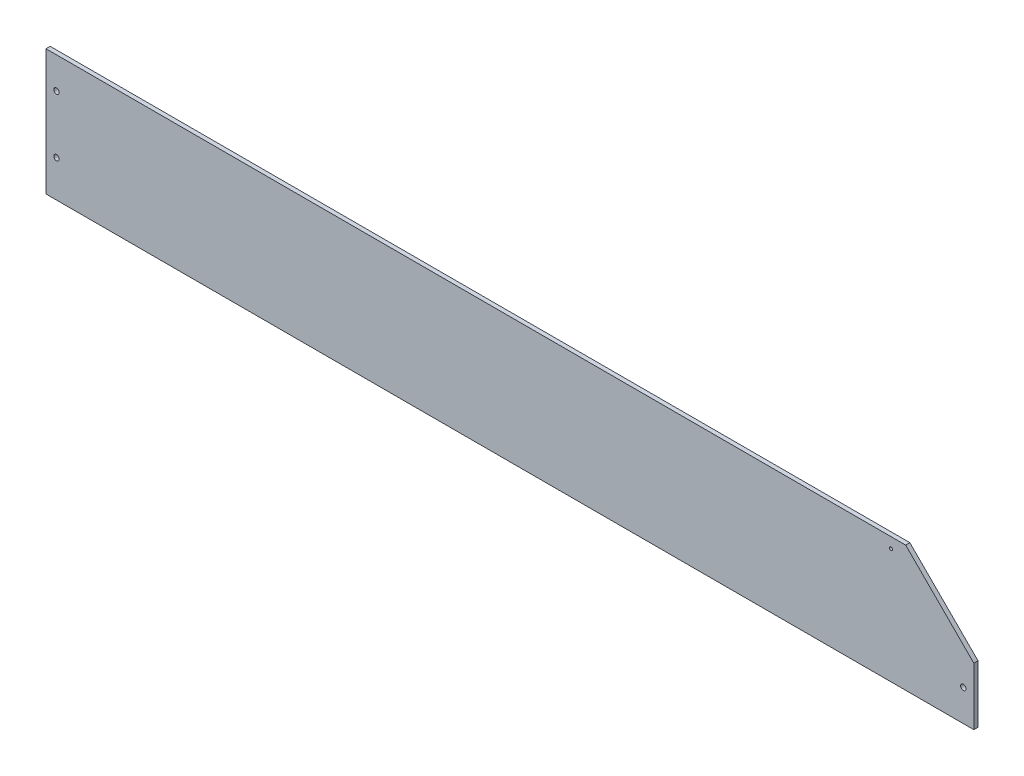
ISO-10303-21;
HEADER;
FILE_DESCRIPTION(('STEP AP214'),'2;1');
FILE_NAME('part.step','',(''),(''),'','','');
FILE_SCHEMA(('AUTOMOTIVE_DESIGN { 1 0 10303 214 1 1 1 1 }'));
ENDSEC;
DATA;
#1=APPLICATION_CONTEXT('core data for automotive mechanical design processes');
#2=APPLICATION_PROTOCOL_DEFINITION('international standard','automotive_design',2000,#1);
#3=PRODUCT_CONTEXT('',#1,'mechanical');
#4=PRODUCT('Part','Part','',(#3));
#5=PRODUCT_RELATED_PRODUCT_CATEGORY('part','',(#4));
#6=PRODUCT_DEFINITION_FORMATION('','',#4);
#7=PRODUCT_DEFINITION_CONTEXT('part definition',#1,'design');
#8=PRODUCT_DEFINITION('design','',#6,#7);
#9=PRODUCT_DEFINITION_SHAPE('','',#8);
#10=(LENGTH_UNIT() NAMED_UNIT(*) SI_UNIT(.MILLI.,.METRE.));
#11=(NAMED_UNIT(*) PLANE_ANGLE_UNIT() SI_UNIT($,.RADIAN.));
#12=(NAMED_UNIT(*) SI_UNIT($,.STERADIAN.) SOLID_ANGLE_UNIT());
#13=UNCERTAINTY_MEASURE_WITH_UNIT(LENGTH_MEASURE(1.E-05),#10,'distance_accuracy_value','');
#14=(GEOMETRIC_REPRESENTATION_CONTEXT(3) GLOBAL_UNCERTAINTY_ASSIGNED_CONTEXT((#13)) GLOBAL_UNIT_ASSIGNED_CONTEXT((#10,
#11,#12)) REPRESENTATION_CONTEXT('',''));
#15=CARTESIAN_POINT('',(0.,0.,0.));
#16=DIRECTION('',(0.,0.,1.));
#17=DIRECTION('',(1.,0.,0.));
#18=AXIS2_PLACEMENT_3D('',#15,#16,#17);
#19=CARTESIAN_POINT('',(0.,120.,-4.));
#20=DIRECTION('',(1.,0.,0.));
#21=DIRECTION('',(0.,0.,1.));
#22=AXIS2_PLACEMENT_3D('',#19,#20,#21);
#23=PLANE('',#22);
#24=DIRECTION('',(0.,-1.,0.));
#25=VECTOR('',#24,1.);
#26=CARTESIAN_POINT('',(0.,120.,0.));
#27=LINE('',#26,#25);
#28=CARTESIAN_POINT('',(0.,120.,0.));
#29=VERTEX_POINT('',#28);
#30=CARTESIAN_POINT('',(0.,0.,0.));
#31=VERTEX_POINT('',#30);
#32=EDGE_CURVE('E113',#29,#31,#27,.T.);
#33=ORIENTED_EDGE('',*,*,#32,.F.);
#34=DIRECTION('',(0.,0.,1.));
#35=VECTOR('',#34,1.);
#36=CARTESIAN_POINT('',(0.,120.,-4.));
#37=LINE('',#36,#35);
#38=CARTESIAN_POINT('',(0.,120.,-4.));
#39=VERTEX_POINT('',#38);
#40=EDGE_CURVE('E112',#39,#29,#37,.T.);
#41=ORIENTED_EDGE('',*,*,#40,.F.);
#42=DIRECTION('',(0.,-1.,0.));
#43=VECTOR('',#42,1.);
#44=CARTESIAN_POINT('',(0.,120.,-4.));
#45=LINE('',#44,#43);
#46=CARTESIAN_POINT('',(0.,0.,-4.));
#47=VERTEX_POINT('',#46);
#48=EDGE_CURVE('E107',#39,#47,#45,.T.);
#49=ORIENTED_EDGE('',*,*,#48,.T.);
#50=DIRECTION('',(0.,0.,1.));
#51=VECTOR('',#50,1.);
#52=CARTESIAN_POINT('',(0.,0.,-4.));
#53=LINE('',#52,#51);
#54=EDGE_CURVE('E11',#47,#31,#53,.T.);
#55=ORIENTED_EDGE('',*,*,#54,.T.);
#56=EDGE_LOOP('',(#33,#41,#49,#55));
#57=FACE_BOUND('',#56,.T.);
#58=ADVANCED_FACE('F38',(#57),#23,.F.);
#59=CARTESIAN_POINT('',(0.,0.,-4.));
#60=DIRECTION('',(0.,1.,0.));
#61=DIRECTION('',(0.,0.,-1.));
#62=AXIS2_PLACEMENT_3D('',#59,#60,#61);
#63=PLANE('',#62);
#64=DIRECTION('',(1.,0.,0.));
#65=VECTOR('',#64,1.);
#66=CARTESIAN_POINT('',(0.,0.,0.));
#67=LINE('',#66,#65);
#68=CARTESIAN_POINT('',(885.,0.,0.));
#69=VERTEX_POINT('',#68);
#70=EDGE_CURVE('E115',#31,#69,#67,.T.);
#71=ORIENTED_EDGE('',*,*,#70,.F.);
#72=ORIENTED_EDGE('',*,*,#54,.F.);
#73=DIRECTION('',(1.,0.,0.));
#74=VECTOR('',#73,1.);
#75=CARTESIAN_POINT('',(0.,0.,-4.));
#76=LINE('',#75,#74);
#77=CARTESIAN_POINT('',(885.,0.,-4.));
#78=VERTEX_POINT('',#77);
#79=EDGE_CURVE('E83',#47,#78,#76,.T.);
#80=ORIENTED_EDGE('',*,*,#79,.T.);
#81=DIRECTION('',(0.,0.,1.));
#82=VECTOR('',#81,1.);
#83=CARTESIAN_POINT('',(885.,0.,-4.));
#84=LINE('',#83,#82);
#85=EDGE_CURVE('E46',#78,#69,#84,.T.);
#86=ORIENTED_EDGE('',*,*,#85,.T.);
#87=EDGE_LOOP('',(#71,#72,#80,#86));
#88=FACE_BOUND('',#87,.T.);
#89=ADVANCED_FACE('F125',(#88),#63,.F.);
#90=CARTESIAN_POINT('',(885.,0.,-4.));
#91=DIRECTION('',(-1.,0.,0.));
#92=DIRECTION('',(0.,0.,-1.));
#93=AXIS2_PLACEMENT_3D('',#90,#91,#92);
#94=PLANE('',#93);
#95=DIRECTION('',(0.,1.,0.));
#96=VECTOR('',#95,1.);
#97=CARTESIAN_POINT('',(885.,0.,0.));
#98=LINE('',#97,#96);
#99=CARTESIAN_POINT('',(885.,55.,0.));
#100=VERTEX_POINT('',#99);
#101=EDGE_CURVE('E119',#69,#100,#98,.T.);
#102=ORIENTED_EDGE('',*,*,#101,.F.);
#103=ORIENTED_EDGE('',*,*,#85,.F.);
#104=DIRECTION('',(0.,1.,0.));
#105=VECTOR('',#104,1.);
#106=CARTESIAN_POINT('',(885.,0.,-4.));
#107=LINE('',#106,#105);
#108=CARTESIAN_POINT('',(885.,55.,-4.));
#109=VERTEX_POINT('',#108);
#110=EDGE_CURVE('E92',#78,#109,#107,.T.);
#111=ORIENTED_EDGE('',*,*,#110,.T.);
#112=DIRECTION('',(0.,0.,1.));
#113=VECTOR('',#112,1.);
#114=CARTESIAN_POINT('',(885.,55.,-4.));
#115=LINE('',#114,#113);
#116=EDGE_CURVE('E97',#109,#100,#115,.T.);
#117=ORIENTED_EDGE('',*,*,#116,.T.);
#118=EDGE_LOOP('',(#102,#103,#111,#117));
#119=FACE_BOUND('',#118,.T.);
#120=ADVANCED_FACE('F104',(#119),#94,.F.);
#121=CARTESIAN_POINT('',(885.,55.,-4.));
#122=DIRECTION('',(-0.707106781186545,-0.70710678118655,0.));
#123=DIRECTION('',(0.70710678118655,-0.707106781186545,0.));
#124=AXIS2_PLACEMENT_3D('',#121,#122,#123);
#125=PLANE('',#124);
#126=DIRECTION('',(-0.70710678118655,0.707106781186545,0.));
#127=VECTOR('',#126,1.);
#128=CARTESIAN_POINT('',(885.,55.,0.));
#129=LINE('',#128,#127);
#130=CARTESIAN_POINT('',(820.,120.,0.));
#131=VERTEX_POINT('',#130);
#132=EDGE_CURVE('E99',#100,#131,#129,.T.);
#133=ORIENTED_EDGE('',*,*,#132,.F.);
#134=ORIENTED_EDGE('',*,*,#116,.F.);
#135=DIRECTION('',(-0.70710678118655,0.707106781186545,0.));
#136=VECTOR('',#135,1.);
#137=CARTESIAN_POINT('',(885.,55.,-4.));
#138=LINE('',#137,#136);
#139=CARTESIAN_POINT('',(820.,120.,-4.));
#140=VERTEX_POINT('',#139);
#141=EDGE_CURVE('E88',#109,#140,#138,.T.);
#142=ORIENTED_EDGE('',*,*,#141,.T.);
#143=DIRECTION('',(0.,0.,1.));
#144=VECTOR('',#143,1.);
#145=CARTESIAN_POINT('',(820.,120.,-4.));
#146=LINE('',#145,#144);
#147=EDGE_CURVE('E102',#140,#131,#146,.T.);
#148=ORIENTED_EDGE('',*,*,#147,.T.);
#149=EDGE_LOOP('',(#133,#134,#142,#148));
#150=FACE_BOUND('',#149,.T.);
#151=ADVANCED_FACE('F98',(#150),#125,.F.);
#152=CARTESIAN_POINT('',(820.,120.,-4.));
#153=DIRECTION('',(0.,-1.,0.));
#154=DIRECTION('',(1.,0.,0.));
#155=AXIS2_PLACEMENT_3D('',#152,#153,#154);
#156=PLANE('',#155);
#157=DIRECTION('',(-1.,0.,0.));
#158=VECTOR('',#157,1.);
#159=CARTESIAN_POINT('',(820.,120.,0.));
#160=LINE('',#159,#158);
#161=EDGE_CURVE('E71',#131,#29,#160,.T.);
#162=ORIENTED_EDGE('',*,*,#161,.F.);
#163=ORIENTED_EDGE('',*,*,#147,.F.);
#164=DIRECTION('',(-1.,0.,0.));
#165=VECTOR('',#164,1.);
#166=CARTESIAN_POINT('',(820.,120.,-4.));
#167=LINE('',#166,#165);
#168=EDGE_CURVE('E54',#140,#39,#167,.T.);
#169=ORIENTED_EDGE('',*,*,#168,.T.);
#170=ORIENTED_EDGE('',*,*,#40,.T.);
#171=EDGE_LOOP('',(#162,#163,#169,#170));
#172=FACE_BOUND('',#171,.T.);
#173=ADVANCED_FACE('F197',(#172),#156,.F.);
#174=CARTESIAN_POINT('',(0.,0.,-4.));
#175=DIRECTION('',(0.,0.,-1.));
#176=DIRECTION('',(1.,0.,0.));
#177=AXIS2_PLACEMENT_3D('',#174,#175,#176);
#178=PLANE('',#177);
#179=CARTESIAN_POINT('',(806.,110.,-4.));
#180=DIRECTION('',(0.,0.,1.));
#181=DIRECTION('',(1.,0.,0.));
#182=AXIS2_PLACEMENT_3D('',#179,#180,#181);
#183=CIRCLE('',#182,1.49999999999997);
#184=CARTESIAN_POINT('',(807.499999999999,110.,-4.));
#185=VERTEX_POINT('',#184);
#186=EDGE_CURVE('E149',#185,#185,#183,.T.);
#187=ORIENTED_EDGE('',*,*,#186,.T.);
#188=EDGE_LOOP('',(#187));
#189=FACE_BOUND('',#188,.T.);
#190=CARTESIAN_POINT('',(875.,30.,-4.));
#191=DIRECTION('',(0.,0.,-1.));
#192=DIRECTION('',(-1.,0.,0.));
#193=AXIS2_PLACEMENT_3D('',#190,#191,#192);
#194=CIRCLE('',#193,2.60000000000007);
#195=CARTESIAN_POINT('',(872.4,30.,-4.));
#196=VERTEX_POINT('',#195);
#197=EDGE_CURVE('E141',#196,#196,#194,.T.);
#198=ORIENTED_EDGE('',*,*,#197,.F.);
#199=EDGE_LOOP('',(#198));
#200=FACE_BOUND('',#199,.T.);
#201=CARTESIAN_POINT('',(10.,90.0000000000001,-4.));
#202=DIRECTION('',(0.,0.,-1.));
#203=DIRECTION('',(-1.,0.,0.));
#204=AXIS2_PLACEMENT_3D('',#201,#202,#203);
#205=CIRCLE('',#204,2.6);
#206=CARTESIAN_POINT('',(7.4,90.0000000000001,-4.));
#207=VERTEX_POINT('',#206);
#208=EDGE_CURVE('E116',#207,#207,#205,.T.);
#209=ORIENTED_EDGE('',*,*,#208,.F.);
#210=EDGE_LOOP('',(#209));
#211=FACE_BOUND('',#210,.T.);
#212=CARTESIAN_POINT('',(10.,35.0000000000001,-4.));
#213=DIRECTION('',(0.,0.,-1.));
#214=DIRECTION('',(-1.,0.,0.));
#215=AXIS2_PLACEMENT_3D('',#212,#213,#214);
#216=CIRCLE('',#215,2.6);
#217=CARTESIAN_POINT('',(7.4,35.0000000000001,-4.));
#218=VERTEX_POINT('',#217);
#219=EDGE_CURVE('E134',#218,#218,#216,.T.);
#220=ORIENTED_EDGE('',*,*,#219,.F.);
#221=EDGE_LOOP('',(#220));
#222=FACE_BOUND('',#221,.T.);
#223=ORIENTED_EDGE('',*,*,#48,.F.);
#224=ORIENTED_EDGE('',*,*,#168,.F.);
#225=ORIENTED_EDGE('',*,*,#141,.F.);
#226=ORIENTED_EDGE('',*,*,#110,.F.);
#227=ORIENTED_EDGE('',*,*,#79,.F.);
#228=EDGE_LOOP('',(#223,#224,#225,#226,#227));
#229=FACE_BOUND('',#228,.T.);
#230=ADVANCED_FACE('F90',(#189,#200,#211,#222,#229),#178,.T.);
#231=CARTESIAN_POINT('',(0.,0.,0.));
#232=DIRECTION('',(0.,0.,-1.));
#233=DIRECTION('',(1.,0.,0.));
#234=AXIS2_PLACEMENT_3D('',#231,#232,#233);
#235=PLANE('',#234);
#236=CARTESIAN_POINT('',(806.,110.,0.));
#237=DIRECTION('',(0.,0.,1.));
#238=DIRECTION('',(1.,0.,0.));
#239=AXIS2_PLACEMENT_3D('',#236,#237,#238);
#240=CIRCLE('',#239,1.49999999999997);
#241=CARTESIAN_POINT('',(807.499999999999,110.,0.));
#242=VERTEX_POINT('',#241);
#243=EDGE_CURVE('E150',#242,#242,#240,.T.);
#244=ORIENTED_EDGE('',*,*,#243,.F.);
#245=EDGE_LOOP('',(#244));
#246=FACE_BOUND('',#245,.T.);
#247=CARTESIAN_POINT('',(875.,30.,0.));
#248=DIRECTION('',(0.,0.,1.));
#249=DIRECTION('',(1.,0.,0.));
#250=AXIS2_PLACEMENT_3D('',#247,#248,#249);
#251=CIRCLE('',#250,2.60000000000007);
#252=CARTESIAN_POINT('',(877.6,30.,0.));
#253=VERTEX_POINT('',#252);
#254=EDGE_CURVE('E146',#253,#253,#251,.T.);
#255=ORIENTED_EDGE('',*,*,#254,.F.);
#256=EDGE_LOOP('',(#255));
#257=FACE_BOUND('',#256,.T.);
#258=CARTESIAN_POINT('',(10.,90.0000000000001,0.));
#259=DIRECTION('',(0.,0.,1.));
#260=DIRECTION('',(1.,0.,0.));
#261=AXIS2_PLACEMENT_3D('',#258,#259,#260);
#262=CIRCLE('',#261,2.6);
#263=CARTESIAN_POINT('',(12.6,90.0000000000001,0.));
#264=VERTEX_POINT('',#263);
#265=EDGE_CURVE('E137',#264,#264,#262,.T.);
#266=ORIENTED_EDGE('',*,*,#265,.F.);
#267=EDGE_LOOP('',(#266));
#268=FACE_BOUND('',#267,.T.);
#269=CARTESIAN_POINT('',(10.,35.0000000000001,0.));
#270=DIRECTION('',(0.,0.,1.));
#271=DIRECTION('',(1.,0.,0.));
#272=AXIS2_PLACEMENT_3D('',#269,#270,#271);
#273=CIRCLE('',#272,2.6);
#274=CARTESIAN_POINT('',(12.6,35.0000000000001,0.));
#275=VERTEX_POINT('',#274);
#276=EDGE_CURVE('E138',#275,#275,#273,.T.);
#277=ORIENTED_EDGE('',*,*,#276,.F.);
#278=EDGE_LOOP('',(#277));
#279=FACE_BOUND('',#278,.T.);
#280=ORIENTED_EDGE('',*,*,#32,.T.);
#281=ORIENTED_EDGE('',*,*,#70,.T.);
#282=ORIENTED_EDGE('',*,*,#101,.T.);
#283=ORIENTED_EDGE('',*,*,#132,.T.);
#284=ORIENTED_EDGE('',*,*,#161,.T.);
#285=EDGE_LOOP('',(#280,#281,#282,#283,#284));
#286=FACE_BOUND('',#285,.T.);
#287=ADVANCED_FACE('F126',(#246,#257,#268,#279,#286),#235,.F.);
#288=CARTESIAN_POINT('',(10.,35.0000000000001,-10.));
#289=DIRECTION('',(0.,0.,1.));
#290=DIRECTION('',(1.,0.,0.));
#291=AXIS2_PLACEMENT_3D('',#288,#289,#290);
#292=CYLINDRICAL_SURFACE('',#291,2.6);
#293=ORIENTED_EDGE('',*,*,#219,.T.);
#294=EDGE_LOOP('',(#293));
#295=FACE_BOUND('',#294,.T.);
#296=ORIENTED_EDGE('',*,*,#276,.T.);
#297=EDGE_LOOP('',(#296));
#298=FACE_BOUND('',#297,.T.);
#299=ADVANCED_FACE('F167',(#295,#298),#292,.F.);
#300=CARTESIAN_POINT('',(10.,90.0000000000001,-10.));
#301=DIRECTION('',(0.,0.,1.));
#302=DIRECTION('',(1.,0.,0.));
#303=AXIS2_PLACEMENT_3D('',#300,#301,#302);
#304=CYLINDRICAL_SURFACE('',#303,2.6);
#305=ORIENTED_EDGE('',*,*,#208,.T.);
#306=EDGE_LOOP('',(#305));
#307=FACE_BOUND('',#306,.T.);
#308=ORIENTED_EDGE('',*,*,#265,.T.);
#309=EDGE_LOOP('',(#308));
#310=FACE_BOUND('',#309,.T.);
#311=ADVANCED_FACE('F176',(#307,#310),#304,.F.);
#312=CARTESIAN_POINT('',(875.,30.,-10.));
#313=DIRECTION('',(0.,0.,1.));
#314=DIRECTION('',(1.,0.,0.));
#315=AXIS2_PLACEMENT_3D('',#312,#313,#314);
#316=CYLINDRICAL_SURFACE('',#315,2.60000000000007);
#317=ORIENTED_EDGE('',*,*,#197,.T.);
#318=EDGE_LOOP('',(#317));
#319=FACE_BOUND('',#318,.T.);
#320=ORIENTED_EDGE('',*,*,#254,.T.);
#321=EDGE_LOOP('',(#320));
#322=FACE_BOUND('',#321,.T.);
#323=ADVANCED_FACE('F161',(#319,#322),#316,.F.);
#324=CARTESIAN_POINT('',(806.,110.,-4.));
#325=DIRECTION('',(0.,0.,1.));
#326=DIRECTION('',(1.,0.,0.));
#327=AXIS2_PLACEMENT_3D('',#324,#325,#326);
#328=CYLINDRICAL_SURFACE('',#327,1.49999999999997);
#329=ORIENTED_EDGE('',*,*,#186,.F.);
#330=EDGE_LOOP('',(#329));
#331=FACE_BOUND('',#330,.T.);
#332=ORIENTED_EDGE('',*,*,#243,.T.);
#333=EDGE_LOOP('',(#332));
#334=FACE_BOUND('',#333,.T.);
#335=ADVANCED_FACE('F158',(#331,#334),#328,.F.);
#336=CLOSED_SHELL('',(#58,#89,#120,#151,#173,#230,#287,#299,#311,#323,#335));
#337=MANIFOLD_SOLID_BREP('B2',#336);
#338=ADVANCED_BREP_SHAPE_REPRESENTATION('',(#18,#337),#14);
#339=SHAPE_DEFINITION_REPRESENTATION(#9,#338);
ENDSEC;
END-ISO-10303-21;
